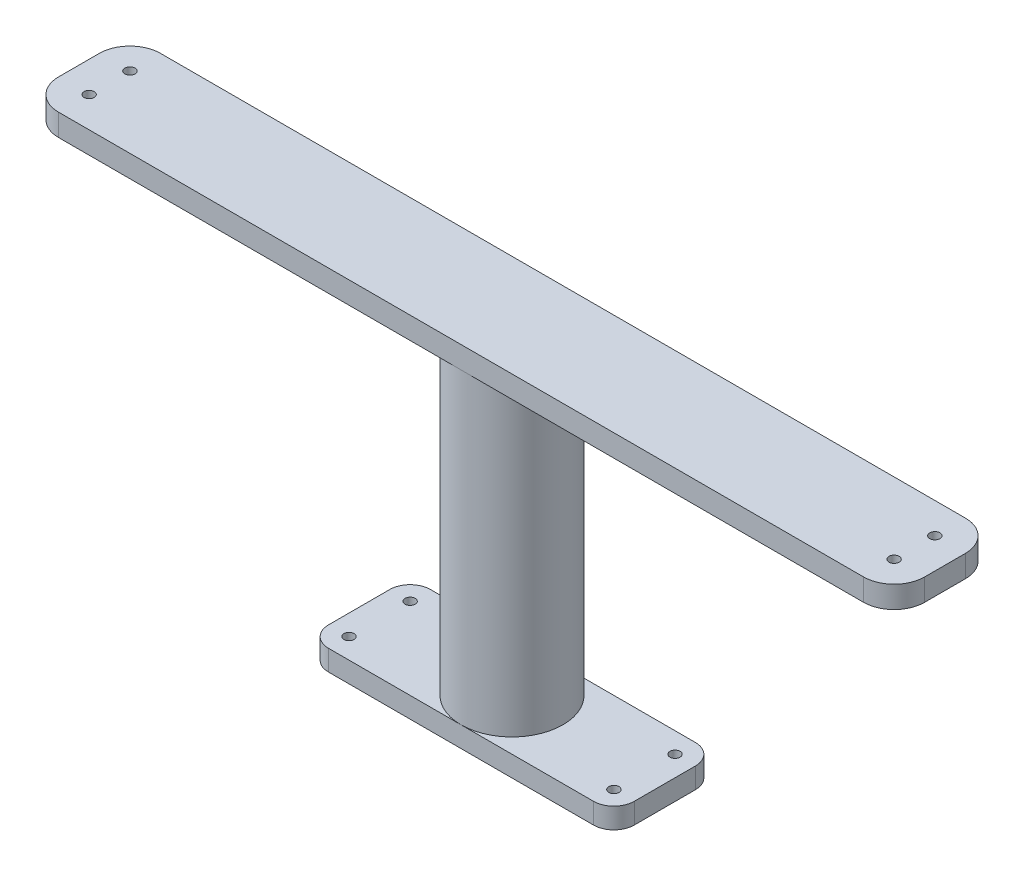
ISO-10303-21;
HEADER;
FILE_DESCRIPTION(('STEP AP214'),'2;1');
FILE_NAME('part.step','',(''),(''),'','','');
FILE_SCHEMA(('AUTOMOTIVE_DESIGN { 1 0 10303 214 1 1 1 1 }'));
ENDSEC;
DATA;
#1=APPLICATION_CONTEXT('core data for automotive mechanical design processes');
#2=APPLICATION_PROTOCOL_DEFINITION('international standard','automotive_design',2000,#1);
#3=PRODUCT_CONTEXT('',#1,'mechanical');
#4=PRODUCT('Part','Part','',(#3));
#5=PRODUCT_RELATED_PRODUCT_CATEGORY('part','',(#4));
#6=PRODUCT_DEFINITION_FORMATION('','',#4);
#7=PRODUCT_DEFINITION_CONTEXT('part definition',#1,'design');
#8=PRODUCT_DEFINITION('design','',#6,#7);
#9=PRODUCT_DEFINITION_SHAPE('','',#8);
#10=(LENGTH_UNIT() NAMED_UNIT(*) SI_UNIT(.MILLI.,.METRE.));
#11=(NAMED_UNIT(*) PLANE_ANGLE_UNIT() SI_UNIT($,.RADIAN.));
#12=(NAMED_UNIT(*) SI_UNIT($,.STERADIAN.) SOLID_ANGLE_UNIT());
#13=UNCERTAINTY_MEASURE_WITH_UNIT(LENGTH_MEASURE(1.E-05),#10,'distance_accuracy_value','');
#14=(GEOMETRIC_REPRESENTATION_CONTEXT(3) GLOBAL_UNCERTAINTY_ASSIGNED_CONTEXT((#13)) GLOBAL_UNIT_ASSIGNED_CONTEXT((#10,
#11,#12)) REPRESENTATION_CONTEXT('',''));
#15=CARTESIAN_POINT('',(0.,0.,0.));
#16=DIRECTION('',(0.,0.,1.));
#17=DIRECTION('',(1.,0.,0.));
#18=AXIS2_PLACEMENT_3D('',#15,#16,#17);
#19=CARTESIAN_POINT('',(0.,-341.625,0.));
#20=DIRECTION('',(0.,1.,0.));
#21=DIRECTION('',(0.,0.,1.));
#22=AXIS2_PLACEMENT_3D('',#19,#20,#21);
#23=CYLINDRICAL_SURFACE('',#22,50.);
#24=CARTESIAN_POINT('',(0.,-20.,0.));
#25=DIRECTION('',(0.,-1.,0.));
#26=DIRECTION('',(0.,0.,-1.));
#27=AXIS2_PLACEMENT_3D('',#24,#25,#26);
#28=CIRCLE('',#27,50.);
#29=CARTESIAN_POINT('',(0.,-20.,-50.));
#30=VERTEX_POINT('',#29);
#31=CARTESIAN_POINT('',(0.,-20.,50.));
#32=VERTEX_POINT('',#31);
#33=EDGE_CURVE('E327',#30,#32,#28,.F.);
#34=ORIENTED_EDGE('',*,*,#33,.F.);
#35=CARTESIAN_POINT('',(0.,-20.,0.));
#36=DIRECTION('',(0.,-1.,0.));
#37=DIRECTION('',(0.,0.,-1.));
#38=AXIS2_PLACEMENT_3D('',#35,#36,#37);
#39=CIRCLE('',#38,50.);
#40=EDGE_CURVE('E295',#30,#32,#39,.T.);
#41=ORIENTED_EDGE('',*,*,#40,.T.);
#42=EDGE_LOOP('',(#34,#41));
#43=FACE_BOUND('',#42,.T.);
#44=CARTESIAN_POINT('',(0.,-321.625,0.));
#45=DIRECTION('',(0.,1.,0.));
#46=DIRECTION('',(0.,0.,1.));
#47=AXIS2_PLACEMENT_3D('',#44,#45,#46);
#48=CIRCLE('',#47,50.);
#49=CARTESIAN_POINT('',(0.,-321.625,50.));
#50=VERTEX_POINT('',#49);
#51=CARTESIAN_POINT('',(0.,-321.625,-50.));
#52=VERTEX_POINT('',#51);
#53=EDGE_CURVE('E280',#50,#52,#48,.F.);
#54=ORIENTED_EDGE('',*,*,#53,.F.);
#55=CARTESIAN_POINT('',(0.,-321.625,0.));
#56=DIRECTION('',(0.,1.,0.));
#57=DIRECTION('',(0.,0.,1.));
#58=AXIS2_PLACEMENT_3D('',#55,#56,#57);
#59=CIRCLE('',#58,50.);
#60=EDGE_CURVE('E270',#50,#52,#59,.T.);
#61=ORIENTED_EDGE('',*,*,#60,.T.);
#62=EDGE_LOOP('',(#54,#61));
#63=FACE_BOUND('',#62,.T.);
#64=ADVANCED_FACE('F108',(#43,#63),#23,.T.);
#65=CARTESIAN_POINT('',(-395.,1.5875,-20.));
#66=DIRECTION('',(0.,1.,0.));
#67=DIRECTION('',(0.,0.,1.));
#68=AXIS2_PLACEMENT_3D('',#65,#66,#67);
#69=PLANE('',#68);
#70=CARTESIAN_POINT('',(395.,1.5875,-20.));
#71=DIRECTION('',(0.,1.,0.));
#72=DIRECTION('',(0.,0.,1.));
#73=AXIS2_PLACEMENT_3D('',#70,#71,#72);
#74=CIRCLE('',#73,4.99999999999999);
#75=CARTESIAN_POINT('',(395.,1.5875,-15.));
#76=VERTEX_POINT('',#75);
#77=EDGE_CURVE('E391',#76,#76,#74,.T.);
#78=ORIENTED_EDGE('',*,*,#77,.F.);
#79=EDGE_LOOP('',(#78));
#80=FACE_BOUND('',#79,.T.);
#81=CARTESIAN_POINT('',(-395.,1.5875,20.));
#82=DIRECTION('',(0.,1.,0.));
#83=DIRECTION('',(0.,0.,1.));
#84=AXIS2_PLACEMENT_3D('',#81,#82,#83);
#85=CIRCLE('',#84,4.99999999999999);
#86=CARTESIAN_POINT('',(-395.,1.5875,25.));
#87=VERTEX_POINT('',#86);
#88=EDGE_CURVE('E397',#87,#87,#85,.T.);
#89=ORIENTED_EDGE('',*,*,#88,.F.);
#90=EDGE_LOOP('',(#89));
#91=FACE_BOUND('',#90,.T.);
#92=CARTESIAN_POINT('',(-395.,1.5875,-20.));
#93=DIRECTION('',(0.,1.,0.));
#94=DIRECTION('',(0.,0.,1.));
#95=AXIS2_PLACEMENT_3D('',#92,#93,#94);
#96=CIRCLE('',#95,30.);
#97=CARTESIAN_POINT('',(-395.,1.5875,-50.));
#98=VERTEX_POINT('',#97);
#99=CARTESIAN_POINT('',(-425.,1.5875,-19.9999999999998));
#100=VERTEX_POINT('',#99);
#101=EDGE_CURVE('E400',#98,#100,#96,.T.);
#102=ORIENTED_EDGE('',*,*,#101,.T.);
#103=DIRECTION('',(0.,0.,1.));
#104=VECTOR('',#103,1.);
#105=CARTESIAN_POINT('',(-425.,1.5875,-19.9999999999998));
#106=LINE('',#105,#104);
#107=CARTESIAN_POINT('',(-425.,1.5875,19.9999999999998));
#108=VERTEX_POINT('',#107);
#109=EDGE_CURVE('E402',#100,#108,#106,.T.);
#110=ORIENTED_EDGE('',*,*,#109,.T.);
#111=CARTESIAN_POINT('',(-395.,1.5875,20.));
#112=DIRECTION('',(0.,1.,0.));
#113=DIRECTION('',(0.,0.,1.));
#114=AXIS2_PLACEMENT_3D('',#111,#112,#113);
#115=CIRCLE('',#114,30.);
#116=CARTESIAN_POINT('',(-395.,1.5875,50.));
#117=VERTEX_POINT('',#116);
#118=EDGE_CURVE('E404',#108,#117,#115,.T.);
#119=ORIENTED_EDGE('',*,*,#118,.T.);
#120=DIRECTION('',(1.,0.,0.));
#121=VECTOR('',#120,1.);
#122=CARTESIAN_POINT('',(-395.,1.5875,50.));
#123=LINE('',#122,#121);
#124=CARTESIAN_POINT('',(395.,1.5875,50.));
#125=VERTEX_POINT('',#124);
#126=EDGE_CURVE('E406',#117,#125,#123,.T.);
#127=ORIENTED_EDGE('',*,*,#126,.T.);
#128=CARTESIAN_POINT('',(395.,1.5875,20.));
#129=DIRECTION('',(0.,1.,0.));
#130=DIRECTION('',(0.,0.,1.));
#131=AXIS2_PLACEMENT_3D('',#128,#129,#130);
#132=CIRCLE('',#131,30.);
#133=CARTESIAN_POINT('',(425.,1.5875,19.9999999999998));
#134=VERTEX_POINT('',#133);
#135=EDGE_CURVE('E408',#125,#134,#132,.T.);
#136=ORIENTED_EDGE('',*,*,#135,.T.);
#137=DIRECTION('',(0.,0.,-1.));
#138=VECTOR('',#137,1.);
#139=CARTESIAN_POINT('',(425.,1.5875,-19.9999999999998));
#140=LINE('',#139,#138);
#141=CARTESIAN_POINT('',(425.,1.5875,-19.9999999999998));
#142=VERTEX_POINT('',#141);
#143=EDGE_CURVE('E410',#134,#142,#140,.T.);
#144=ORIENTED_EDGE('',*,*,#143,.T.);
#145=CARTESIAN_POINT('',(395.,1.5875,-20.));
#146=DIRECTION('',(0.,1.,0.));
#147=DIRECTION('',(0.,0.,-1.));
#148=AXIS2_PLACEMENT_3D('',#145,#146,#147);
#149=CIRCLE('',#148,30.);
#150=CARTESIAN_POINT('',(395.,1.5875,-50.));
#151=VERTEX_POINT('',#150);
#152=EDGE_CURVE('E129',#142,#151,#149,.T.);
#153=ORIENTED_EDGE('',*,*,#152,.T.);
#154=DIRECTION('',(-1.,0.,0.));
#155=VECTOR('',#154,1.);
#156=CARTESIAN_POINT('',(-395.,1.5875,-50.));
#157=LINE('',#156,#155);
#158=EDGE_CURVE('E124',#151,#98,#157,.T.);
#159=ORIENTED_EDGE('',*,*,#158,.T.);
#160=EDGE_LOOP('',(#102,#110,#119,#127,#136,#144,#153,#159));
#161=FACE_BOUND('',#160,.T.);
#162=CARTESIAN_POINT('',(-395.,1.5875,-20.));
#163=DIRECTION('',(0.,1.,0.));
#164=DIRECTION('',(0.,0.,1.));
#165=AXIS2_PLACEMENT_3D('',#162,#163,#164);
#166=CIRCLE('',#165,4.99999999999999);
#167=CARTESIAN_POINT('',(-395.,1.5875,-15.));
#168=VERTEX_POINT('',#167);
#169=EDGE_CURVE('E394',#168,#168,#166,.T.);
#170=ORIENTED_EDGE('',*,*,#169,.F.);
#171=EDGE_LOOP('',(#170));
#172=FACE_BOUND('',#171,.T.);
#173=CARTESIAN_POINT('',(395.,1.5875,20.));
#174=DIRECTION('',(0.,1.,0.));
#175=DIRECTION('',(0.,0.,1.));
#176=AXIS2_PLACEMENT_3D('',#173,#174,#175);
#177=CIRCLE('',#176,4.99999999999999);
#178=CARTESIAN_POINT('',(395.,1.5875,25.));
#179=VERTEX_POINT('',#178);
#180=EDGE_CURVE('E388',#179,#179,#177,.T.);
#181=ORIENTED_EDGE('',*,*,#180,.F.);
#182=EDGE_LOOP('',(#181));
#183=FACE_BOUND('',#182,.T.);
#184=ADVANCED_FACE('F457',(#80,#91,#161,#172,#183),#69,.T.);
#185=CARTESIAN_POINT('',(-395.,1.5875,-20.));
#186=DIRECTION('',(0.,-1.,0.));
#187=DIRECTION('',(0.,0.,-1.));
#188=AXIS2_PLACEMENT_3D('',#185,#186,#187);
#189=CYLINDRICAL_SURFACE('',#188,30.);
#190=DIRECTION('',(0.,-1.,0.));
#191=VECTOR('',#190,1.);
#192=CARTESIAN_POINT('',(-395.,1.5875,-50.));
#193=LINE('',#192,#191);
#194=CARTESIAN_POINT('',(-395.,-20.,-50.));
#195=VERTEX_POINT('',#194);
#196=EDGE_CURVE('E414',#98,#195,#193,.T.);
#197=ORIENTED_EDGE('',*,*,#196,.T.);
#198=CARTESIAN_POINT('',(-395.,-20.,-20.));
#199=DIRECTION('',(0.,-1.,0.));
#200=DIRECTION('',(0.,0.,-1.));
#201=AXIS2_PLACEMENT_3D('',#198,#199,#200);
#202=CIRCLE('',#201,30.);
#203=CARTESIAN_POINT('',(-425.,-20.,-19.9999999999998));
#204=VERTEX_POINT('',#203);
#205=EDGE_CURVE('E339',#204,#195,#202,.T.);
#206=ORIENTED_EDGE('',*,*,#205,.F.);
#207=DIRECTION('',(0.,-1.,0.));
#208=VECTOR('',#207,1.);
#209=CARTESIAN_POINT('',(-425.,1.5875,-19.9999999999998));
#210=LINE('',#209,#208);
#211=EDGE_CURVE('E12',#100,#204,#210,.T.);
#212=ORIENTED_EDGE('',*,*,#211,.F.);
#213=ORIENTED_EDGE('',*,*,#101,.F.);
#214=EDGE_LOOP('',(#197,#206,#212,#213));
#215=FACE_BOUND('',#214,.T.);
#216=ADVANCED_FACE('F110',(#215),#189,.T.);
#217=CARTESIAN_POINT('',(-425.,1.5875,-19.9999999999998));
#218=DIRECTION('',(1.,0.,0.));
#219=DIRECTION('',(0.,0.,-1.));
#220=AXIS2_PLACEMENT_3D('',#217,#218,#219);
#221=PLANE('',#220);
#222=ORIENTED_EDGE('',*,*,#211,.T.);
#223=DIRECTION('',(0.,0.,-1.));
#224=VECTOR('',#223,1.);
#225=CARTESIAN_POINT('',(-425.,-20.,0.));
#226=LINE('',#225,#224);
#227=CARTESIAN_POINT('',(-425.,-20.,19.9999999999998));
#228=VERTEX_POINT('',#227);
#229=EDGE_CURVE('E336',#228,#204,#226,.T.);
#230=ORIENTED_EDGE('',*,*,#229,.F.);
#231=DIRECTION('',(0.,-1.,0.));
#232=VECTOR('',#231,1.);
#233=CARTESIAN_POINT('',(-425.,1.5875,19.9999999999998));
#234=LINE('',#233,#232);
#235=EDGE_CURVE('E117',#108,#228,#234,.T.);
#236=ORIENTED_EDGE('',*,*,#235,.F.);
#237=ORIENTED_EDGE('',*,*,#109,.F.);
#238=EDGE_LOOP('',(#222,#230,#236,#237));
#239=FACE_BOUND('',#238,.T.);
#240=ADVANCED_FACE('F437',(#239),#221,.F.);
#241=CARTESIAN_POINT('',(-395.,1.5875,20.));
#242=DIRECTION('',(0.,-1.,0.));
#243=DIRECTION('',(0.,0.,-1.));
#244=AXIS2_PLACEMENT_3D('',#241,#242,#243);
#245=CYLINDRICAL_SURFACE('',#244,30.);
#246=ORIENTED_EDGE('',*,*,#235,.T.);
#247=CARTESIAN_POINT('',(-395.,-20.,20.));
#248=DIRECTION('',(0.,-1.,0.));
#249=DIRECTION('',(0.,0.,-1.));
#250=AXIS2_PLACEMENT_3D('',#247,#248,#249);
#251=CIRCLE('',#250,30.);
#252=CARTESIAN_POINT('',(-395.,-20.,50.));
#253=VERTEX_POINT('',#252);
#254=EDGE_CURVE('E333',#253,#228,#251,.T.);
#255=ORIENTED_EDGE('',*,*,#254,.F.);
#256=DIRECTION('',(0.,-1.,0.));
#257=VECTOR('',#256,1.);
#258=CARTESIAN_POINT('',(-395.,1.5875,50.));
#259=LINE('',#258,#257);
#260=EDGE_CURVE('E424',#117,#253,#259,.T.);
#261=ORIENTED_EDGE('',*,*,#260,.F.);
#262=ORIENTED_EDGE('',*,*,#118,.F.);
#263=EDGE_LOOP('',(#246,#255,#261,#262));
#264=FACE_BOUND('',#263,.T.);
#265=ADVANCED_FACE('F429',(#264),#245,.T.);
#266=CARTESIAN_POINT('',(-395.,1.5875,50.));
#267=DIRECTION('',(0.,0.,-1.));
#268=DIRECTION('',(-1.,0.,0.));
#269=AXIS2_PLACEMENT_3D('',#266,#267,#268);
#270=PLANE('',#269);
#271=DIRECTION('',(-1.,0.,0.));
#272=VECTOR('',#271,1.);
#273=CARTESIAN_POINT('',(0.,-20.,50.));
#274=LINE('',#273,#272);
#275=CARTESIAN_POINT('',(395.,-20.,50.));
#276=VERTEX_POINT('',#275);
#277=EDGE_CURVE('E303',#276,#32,#274,.T.);
#278=ORIENTED_EDGE('',*,*,#277,.F.);
#279=DIRECTION('',(0.,-1.,0.));
#280=VECTOR('',#279,1.);
#281=CARTESIAN_POINT('',(395.,1.5875,50.));
#282=LINE('',#281,#280);
#283=EDGE_CURVE('E422',#125,#276,#282,.T.);
#284=ORIENTED_EDGE('',*,*,#283,.F.);
#285=ORIENTED_EDGE('',*,*,#126,.F.);
#286=ORIENTED_EDGE('',*,*,#260,.T.);
#287=DIRECTION('',(-1.,0.,0.));
#288=VECTOR('',#287,1.);
#289=CARTESIAN_POINT('',(0.,-20.,50.));
#290=LINE('',#289,#288);
#291=EDGE_CURVE('E330',#32,#253,#290,.T.);
#292=ORIENTED_EDGE('',*,*,#291,.F.);
#293=EDGE_LOOP('',(#278,#284,#285,#286,#292));
#294=FACE_BOUND('',#293,.T.);
#295=ADVANCED_FACE('F453',(#294),#270,.F.);
#296=CARTESIAN_POINT('',(395.,1.5875,20.));
#297=DIRECTION('',(0.,-1.,0.));
#298=DIRECTION('',(0.,0.,-1.));
#299=AXIS2_PLACEMENT_3D('',#296,#297,#298);
#300=CYLINDRICAL_SURFACE('',#299,30.);
#301=ORIENTED_EDGE('',*,*,#283,.T.);
#302=CARTESIAN_POINT('',(395.,-20.,20.));
#303=DIRECTION('',(0.,-1.,0.));
#304=DIRECTION('',(0.,0.,-1.));
#305=AXIS2_PLACEMENT_3D('',#302,#303,#304);
#306=CIRCLE('',#305,30.);
#307=CARTESIAN_POINT('',(425.,-20.,19.9999999999998));
#308=VERTEX_POINT('',#307);
#309=EDGE_CURVE('E308',#308,#276,#306,.T.);
#310=ORIENTED_EDGE('',*,*,#309,.F.);
#311=DIRECTION('',(0.,-1.,0.));
#312=VECTOR('',#311,1.);
#313=CARTESIAN_POINT('',(425.,1.5875,19.9999999999998));
#314=LINE('',#313,#312);
#315=EDGE_CURVE('E420',#134,#308,#314,.T.);
#316=ORIENTED_EDGE('',*,*,#315,.F.);
#317=ORIENTED_EDGE('',*,*,#135,.F.);
#318=EDGE_LOOP('',(#301,#310,#316,#317));
#319=FACE_BOUND('',#318,.T.);
#320=ADVANCED_FACE('F464',(#319),#300,.T.);
#321=CARTESIAN_POINT('',(425.,1.5875,-19.9999999999998));
#322=DIRECTION('',(-1.,0.,0.));
#323=DIRECTION('',(0.,0.,1.));
#324=AXIS2_PLACEMENT_3D('',#321,#322,#323);
#325=PLANE('',#324);
#326=ORIENTED_EDGE('',*,*,#315,.T.);
#327=DIRECTION('',(0.,0.,1.));
#328=VECTOR('',#327,1.);
#329=CARTESIAN_POINT('',(425.,-20.,0.));
#330=LINE('',#329,#328);
#331=CARTESIAN_POINT('',(425.,-20.,-19.9999999999998));
#332=VERTEX_POINT('',#331);
#333=EDGE_CURVE('E311',#332,#308,#330,.T.);
#334=ORIENTED_EDGE('',*,*,#333,.F.);
#335=DIRECTION('',(0.,-1.,0.));
#336=VECTOR('',#335,1.);
#337=CARTESIAN_POINT('',(425.,1.5875,-19.9999999999998));
#338=LINE('',#337,#336);
#339=EDGE_CURVE('E418',#142,#332,#338,.T.);
#340=ORIENTED_EDGE('',*,*,#339,.F.);
#341=ORIENTED_EDGE('',*,*,#143,.F.);
#342=EDGE_LOOP('',(#326,#334,#340,#341));
#343=FACE_BOUND('',#342,.T.);
#344=ADVANCED_FACE('F467',(#343),#325,.F.);
#345=CARTESIAN_POINT('',(395.,1.5875,-20.));
#346=DIRECTION('',(0.,-1.,0.));
#347=DIRECTION('',(0.,0.,-1.));
#348=AXIS2_PLACEMENT_3D('',#345,#346,#347);
#349=CYLINDRICAL_SURFACE('',#348,30.);
#350=ORIENTED_EDGE('',*,*,#339,.T.);
#351=CARTESIAN_POINT('',(395.,-20.,-20.));
#352=DIRECTION('',(0.,-1.,0.));
#353=DIRECTION('',(0.,0.,-1.));
#354=AXIS2_PLACEMENT_3D('',#351,#352,#353);
#355=CIRCLE('',#354,30.);
#356=CARTESIAN_POINT('',(395.,-20.,-50.));
#357=VERTEX_POINT('',#356);
#358=EDGE_CURVE('E296',#357,#332,#355,.T.);
#359=ORIENTED_EDGE('',*,*,#358,.F.);
#360=DIRECTION('',(0.,-1.,0.));
#361=VECTOR('',#360,1.);
#362=CARTESIAN_POINT('',(395.,1.5875,-50.));
#363=LINE('',#362,#361);
#364=EDGE_CURVE('E416',#151,#357,#363,.T.);
#365=ORIENTED_EDGE('',*,*,#364,.F.);
#366=ORIENTED_EDGE('',*,*,#152,.F.);
#367=EDGE_LOOP('',(#350,#359,#365,#366));
#368=FACE_BOUND('',#367,.T.);
#369=ADVANCED_FACE('F469',(#368),#349,.T.);
#370=CARTESIAN_POINT('',(-395.,1.5875,-50.));
#371=DIRECTION('',(0.,0.,1.));
#372=DIRECTION('',(1.,0.,0.));
#373=AXIS2_PLACEMENT_3D('',#370,#371,#372);
#374=PLANE('',#373);
#375=ORIENTED_EDGE('',*,*,#364,.T.);
#376=DIRECTION('',(1.,0.,0.));
#377=VECTOR('',#376,1.);
#378=CARTESIAN_POINT('',(0.,-20.,-50.));
#379=LINE('',#378,#377);
#380=EDGE_CURVE('E300',#30,#357,#379,.T.);
#381=ORIENTED_EDGE('',*,*,#380,.F.);
#382=DIRECTION('',(1.,0.,0.));
#383=VECTOR('',#382,1.);
#384=CARTESIAN_POINT('',(0.,-20.,-50.));
#385=LINE('',#384,#383);
#386=EDGE_CURVE('E324',#195,#30,#385,.T.);
#387=ORIENTED_EDGE('',*,*,#386,.F.);
#388=ORIENTED_EDGE('',*,*,#196,.F.);
#389=ORIENTED_EDGE('',*,*,#158,.F.);
#390=EDGE_LOOP('',(#375,#381,#387,#388,#389));
#391=FACE_BOUND('',#390,.T.);
#392=ADVANCED_FACE('F444',(#391),#374,.F.);
#393=CARTESIAN_POINT('',(-395.,1.5875,20.));
#394=DIRECTION('',(0.,-1.,0.));
#395=DIRECTION('',(0.,0.,-1.));
#396=AXIS2_PLACEMENT_3D('',#393,#394,#395);
#397=CYLINDRICAL_SURFACE('',#396,4.99999999999999);
#398=ORIENTED_EDGE('',*,*,#88,.T.);
#399=EDGE_LOOP('',(#398));
#400=FACE_BOUND('',#399,.T.);
#401=CARTESIAN_POINT('',(-395.,-20.,20.));
#402=DIRECTION('',(0.,-1.,0.));
#403=DIRECTION('',(0.,0.,-1.));
#404=AXIS2_PLACEMENT_3D('',#401,#402,#403);
#405=CIRCLE('',#404,4.99999999999999);
#406=CARTESIAN_POINT('',(-395.,-20.,15.));
#407=VERTEX_POINT('',#406);
#408=EDGE_CURVE('E299',#407,#407,#405,.F.);
#409=ORIENTED_EDGE('',*,*,#408,.F.);
#410=EDGE_LOOP('',(#409));
#411=FACE_BOUND('',#410,.T.);
#412=ADVANCED_FACE('F476',(#400,#411),#397,.F.);
#413=CARTESIAN_POINT('',(-395.,1.5875,-20.));
#414=DIRECTION('',(0.,-1.,0.));
#415=DIRECTION('',(0.,0.,-1.));
#416=AXIS2_PLACEMENT_3D('',#413,#414,#415);
#417=CYLINDRICAL_SURFACE('',#416,4.99999999999999);
#418=ORIENTED_EDGE('',*,*,#169,.T.);
#419=EDGE_LOOP('',(#418));
#420=FACE_BOUND('',#419,.T.);
#421=CARTESIAN_POINT('',(-395.,-20.,-20.));
#422=DIRECTION('',(0.,-1.,0.));
#423=DIRECTION('',(0.,0.,-1.));
#424=AXIS2_PLACEMENT_3D('',#421,#422,#423);
#425=CIRCLE('',#424,4.99999999999999);
#426=CARTESIAN_POINT('',(-395.,-20.,-25.));
#427=VERTEX_POINT('',#426);
#428=EDGE_CURVE('E321',#427,#427,#425,.F.);
#429=ORIENTED_EDGE('',*,*,#428,.F.);
#430=EDGE_LOOP('',(#429));
#431=FACE_BOUND('',#430,.T.);
#432=ADVANCED_FACE('F498',(#420,#431),#417,.F.);
#433=CARTESIAN_POINT('',(395.,1.5875,-20.));
#434=DIRECTION('',(0.,-1.,0.));
#435=DIRECTION('',(0.,0.,-1.));
#436=AXIS2_PLACEMENT_3D('',#433,#434,#435);
#437=CYLINDRICAL_SURFACE('',#436,4.99999999999999);
#438=ORIENTED_EDGE('',*,*,#77,.T.);
#439=EDGE_LOOP('',(#438));
#440=FACE_BOUND('',#439,.T.);
#441=CARTESIAN_POINT('',(395.,-20.,-20.));
#442=DIRECTION('',(0.,-1.,0.));
#443=DIRECTION('',(0.,0.,-1.));
#444=AXIS2_PLACEMENT_3D('',#441,#442,#443);
#445=CIRCLE('',#444,4.99999999999999);
#446=CARTESIAN_POINT('',(395.,-20.,-25.));
#447=VERTEX_POINT('',#446);
#448=EDGE_CURVE('E314',#447,#447,#445,.T.);
#449=ORIENTED_EDGE('',*,*,#448,.T.);
#450=EDGE_LOOP('',(#449));
#451=FACE_BOUND('',#450,.T.);
#452=ADVANCED_FACE('F494',(#440,#451),#437,.F.);
#453=CARTESIAN_POINT('',(395.,1.5875,20.));
#454=DIRECTION('',(0.,-1.,0.));
#455=DIRECTION('',(0.,0.,-1.));
#456=AXIS2_PLACEMENT_3D('',#453,#454,#455);
#457=CYLINDRICAL_SURFACE('',#456,4.99999999999999);
#458=ORIENTED_EDGE('',*,*,#180,.T.);
#459=EDGE_LOOP('',(#458));
#460=FACE_BOUND('',#459,.T.);
#461=CARTESIAN_POINT('',(395.,-20.,20.));
#462=DIRECTION('',(0.,-1.,0.));
#463=DIRECTION('',(0.,0.,-1.));
#464=AXIS2_PLACEMENT_3D('',#461,#462,#463);
#465=CIRCLE('',#464,4.99999999999999);
#466=CARTESIAN_POINT('',(395.,-20.,15.));
#467=VERTEX_POINT('',#466);
#468=EDGE_CURVE('E306',#467,#467,#465,.T.);
#469=ORIENTED_EDGE('',*,*,#468,.T.);
#470=EDGE_LOOP('',(#469));
#471=FACE_BOUND('',#470,.T.);
#472=ADVANCED_FACE('F490',(#460,#471),#457,.F.);
#473=CARTESIAN_POINT('',(-130.,-341.843965517241,30.));
#474=DIRECTION('',(0.,-1.,0.));
#475=DIRECTION('',(0.,0.,-1.));
#476=AXIS2_PLACEMENT_3D('',#473,#474,#475);
#477=PLANE('',#476);
#478=CARTESIAN_POINT('',(130.,-341.843965517241,30.));
#479=DIRECTION('',(0.,-1.,0.));
#480=DIRECTION('',(0.,0.,-1.));
#481=AXIS2_PLACEMENT_3D('',#478,#479,#480);
#482=CIRCLE('',#481,5.00000000000002);
#483=CARTESIAN_POINT('',(130.,-341.843965517241,25.));
#484=VERTEX_POINT('',#483);
#485=EDGE_CURVE('E345',#484,#484,#482,.T.);
#486=ORIENTED_EDGE('',*,*,#485,.F.);
#487=EDGE_LOOP('',(#486));
#488=FACE_BOUND('',#487,.T.);
#489=CARTESIAN_POINT('',(-130.,-341.843965517241,-30.));
#490=DIRECTION('',(0.,-1.,0.));
#491=DIRECTION('',(0.,0.,-1.));
#492=AXIS2_PLACEMENT_3D('',#489,#490,#491);
#493=CIRCLE('',#492,5.00000000000002);
#494=CARTESIAN_POINT('',(-130.,-341.843965517241,-35.));
#495=VERTEX_POINT('',#494);
#496=EDGE_CURVE('E351',#495,#495,#493,.T.);
#497=ORIENTED_EDGE('',*,*,#496,.F.);
#498=EDGE_LOOP('',(#497));
#499=FACE_BOUND('',#498,.T.);
#500=CARTESIAN_POINT('',(-130.,-341.843965517241,30.));
#501=DIRECTION('',(0.,-1.,0.));
#502=DIRECTION('',(0.,0.,-1.));
#503=AXIS2_PLACEMENT_3D('',#500,#501,#502);
#504=CIRCLE('',#503,20.);
#505=CARTESIAN_POINT('',(-130.,-341.843965517241,50.));
#506=VERTEX_POINT('',#505);
#507=CARTESIAN_POINT('',(-150.,-341.843965517241,29.9999999999999));
#508=VERTEX_POINT('',#507);
#509=EDGE_CURVE('E354',#506,#508,#504,.T.);
#510=ORIENTED_EDGE('',*,*,#509,.T.);
#511=DIRECTION('',(0.,0.,-1.));
#512=VECTOR('',#511,1.);
#513=CARTESIAN_POINT('',(-150.,-341.843965517241,29.9999999999999));
#514=LINE('',#513,#512);
#515=CARTESIAN_POINT('',(-150.,-341.843965517241,-29.9999999999999));
#516=VERTEX_POINT('',#515);
#517=EDGE_CURVE('E357',#508,#516,#514,.T.);
#518=ORIENTED_EDGE('',*,*,#517,.T.);
#519=CARTESIAN_POINT('',(-130.,-341.843965517241,-30.));
#520=DIRECTION('',(0.,-1.,0.));
#521=DIRECTION('',(0.,0.,-1.));
#522=AXIS2_PLACEMENT_3D('',#519,#520,#521);
#523=CIRCLE('',#522,20.);
#524=CARTESIAN_POINT('',(-130.,-341.843965517241,-50.));
#525=VERTEX_POINT('',#524);
#526=EDGE_CURVE('E359',#516,#525,#523,.T.);
#527=ORIENTED_EDGE('',*,*,#526,.T.);
#528=DIRECTION('',(1.,0.,0.));
#529=VECTOR('',#528,1.);
#530=CARTESIAN_POINT('',(-130.,-341.843965517241,-50.));
#531=LINE('',#530,#529);
#532=CARTESIAN_POINT('',(130.,-341.843965517241,-50.));
#533=VERTEX_POINT('',#532);
#534=EDGE_CURVE('E361',#525,#533,#531,.T.);
#535=ORIENTED_EDGE('',*,*,#534,.T.);
#536=CARTESIAN_POINT('',(130.,-341.843965517241,-30.));
#537=DIRECTION('',(0.,-1.,0.));
#538=DIRECTION('',(0.,0.,-1.));
#539=AXIS2_PLACEMENT_3D('',#536,#537,#538);
#540=CIRCLE('',#539,20.);
#541=CARTESIAN_POINT('',(150.,-341.843965517241,-29.9999999999999));
#542=VERTEX_POINT('',#541);
#543=EDGE_CURVE('E363',#533,#542,#540,.T.);
#544=ORIENTED_EDGE('',*,*,#543,.T.);
#545=DIRECTION('',(0.,0.,1.));
#546=VECTOR('',#545,1.);
#547=CARTESIAN_POINT('',(150.,-341.843965517241,29.9999999999999));
#548=LINE('',#547,#546);
#549=CARTESIAN_POINT('',(150.,-341.843965517241,29.9999999999999));
#550=VERTEX_POINT('',#549);
#551=EDGE_CURVE('E365',#542,#550,#548,.T.);
#552=ORIENTED_EDGE('',*,*,#551,.T.);
#553=CARTESIAN_POINT('',(130.,-341.843965517241,30.));
#554=DIRECTION('',(0.,-1.,0.));
#555=DIRECTION('',(0.,0.,1.));
#556=AXIS2_PLACEMENT_3D('',#553,#554,#555);
#557=CIRCLE('',#556,20.);
#558=CARTESIAN_POINT('',(130.,-341.843965517241,50.));
#559=VERTEX_POINT('',#558);
#560=EDGE_CURVE('E239',#550,#559,#557,.T.);
#561=ORIENTED_EDGE('',*,*,#560,.T.);
#562=DIRECTION('',(-1.,0.,0.));
#563=VECTOR('',#562,1.);
#564=CARTESIAN_POINT('',(-130.,-341.843965517241,50.));
#565=LINE('',#564,#563);
#566=EDGE_CURVE('E368',#559,#506,#565,.T.);
#567=ORIENTED_EDGE('',*,*,#566,.T.);
#568=EDGE_LOOP('',(#510,#518,#527,#535,#544,#552,#561,#567));
#569=FACE_BOUND('',#568,.T.);
#570=CARTESIAN_POINT('',(-130.,-341.843965517241,30.));
#571=DIRECTION('',(0.,-1.,0.));
#572=DIRECTION('',(0.,0.,-1.));
#573=AXIS2_PLACEMENT_3D('',#570,#571,#572);
#574=CIRCLE('',#573,5.00000000000002);
#575=CARTESIAN_POINT('',(-130.,-341.843965517241,25.));
#576=VERTEX_POINT('',#575);
#577=EDGE_CURVE('E348',#576,#576,#574,.T.);
#578=ORIENTED_EDGE('',*,*,#577,.F.);
#579=EDGE_LOOP('',(#578));
#580=FACE_BOUND('',#579,.T.);
#581=CARTESIAN_POINT('',(130.,-341.843965517241,-30.));
#582=DIRECTION('',(0.,-1.,0.));
#583=DIRECTION('',(0.,0.,-1.));
#584=AXIS2_PLACEMENT_3D('',#581,#582,#583);
#585=CIRCLE('',#584,5.00000000000002);
#586=CARTESIAN_POINT('',(130.,-341.843965517241,-35.));
#587=VERTEX_POINT('',#586);
#588=EDGE_CURVE('E342',#587,#587,#585,.T.);
#589=ORIENTED_EDGE('',*,*,#588,.F.);
#590=EDGE_LOOP('',(#589));
#591=FACE_BOUND('',#590,.T.);
#592=ADVANCED_FACE('F493',(#488,#499,#569,#580,#591),#477,.T.);
#593=CARTESIAN_POINT('',(-130.,-341.843965517241,30.));
#594=DIRECTION('',(0.,1.,0.));
#595=DIRECTION('',(0.,0.,1.));
#596=AXIS2_PLACEMENT_3D('',#593,#594,#595);
#597=CYLINDRICAL_SURFACE('',#596,20.);
#598=DIRECTION('',(0.,1.,0.));
#599=VECTOR('',#598,1.);
#600=CARTESIAN_POINT('',(-130.,-341.843965517241,50.));
#601=LINE('',#600,#599);
#602=CARTESIAN_POINT('',(-130.,-321.625,50.));
#603=VERTEX_POINT('',#602);
#604=EDGE_CURVE('E370',#506,#603,#601,.T.);
#605=ORIENTED_EDGE('',*,*,#604,.T.);
#606=CARTESIAN_POINT('',(-130.,-321.625,30.));
#607=DIRECTION('',(0.,1.,0.));
#608=DIRECTION('',(0.,0.,1.));
#609=AXIS2_PLACEMENT_3D('',#606,#607,#608);
#610=CIRCLE('',#609,20.);
#611=CARTESIAN_POINT('',(-150.,-321.625,29.9999999999999));
#612=VERTEX_POINT('',#611);
#613=EDGE_CURVE('E274',#612,#603,#610,.T.);
#614=ORIENTED_EDGE('',*,*,#613,.F.);
#615=DIRECTION('',(0.,1.,0.));
#616=VECTOR('',#615,1.);
#617=CARTESIAN_POINT('',(-150.,-341.843965517241,29.9999999999999));
#618=LINE('',#617,#616);
#619=EDGE_CURVE('E380',#508,#612,#618,.T.);
#620=ORIENTED_EDGE('',*,*,#619,.F.);
#621=ORIENTED_EDGE('',*,*,#509,.F.);
#622=EDGE_LOOP('',(#605,#614,#620,#621));
#623=FACE_BOUND('',#622,.T.);
#624=ADVANCED_FACE('F552',(#623),#597,.T.);
#625=CARTESIAN_POINT('',(-150.,-341.843965517241,29.9999999999999));
#626=DIRECTION('',(1.,0.,0.));
#627=DIRECTION('',(0.,0.,-1.));
#628=AXIS2_PLACEMENT_3D('',#625,#626,#627);
#629=PLANE('',#628);
#630=ORIENTED_EDGE('',*,*,#619,.T.);
#631=DIRECTION('',(0.,0.,1.));
#632=VECTOR('',#631,1.);
#633=CARTESIAN_POINT('',(-150.,-321.625,0.));
#634=LINE('',#633,#632);
#635=CARTESIAN_POINT('',(-150.,-321.625,-29.9999999999999));
#636=VERTEX_POINT('',#635);
#637=EDGE_CURVE('E289',#636,#612,#634,.T.);
#638=ORIENTED_EDGE('',*,*,#637,.F.);
#639=DIRECTION('',(0.,1.,0.));
#640=VECTOR('',#639,1.);
#641=CARTESIAN_POINT('',(-150.,-341.843965517241,-29.9999999999999));
#642=LINE('',#641,#640);
#643=EDGE_CURVE('E378',#516,#636,#642,.T.);
#644=ORIENTED_EDGE('',*,*,#643,.F.);
#645=ORIENTED_EDGE('',*,*,#517,.F.);
#646=EDGE_LOOP('',(#630,#638,#644,#645));
#647=FACE_BOUND('',#646,.T.);
#648=ADVANCED_FACE('F549',(#647),#629,.F.);
#649=CARTESIAN_POINT('',(-130.,-341.843965517241,-30.));
#650=DIRECTION('',(0.,1.,0.));
#651=DIRECTION('',(0.,0.,1.));
#652=AXIS2_PLACEMENT_3D('',#649,#650,#651);
#653=CYLINDRICAL_SURFACE('',#652,20.);
#654=ORIENTED_EDGE('',*,*,#643,.T.);
#655=CARTESIAN_POINT('',(-130.,-321.625,-30.));
#656=DIRECTION('',(0.,1.,0.));
#657=DIRECTION('',(0.,0.,1.));
#658=AXIS2_PLACEMENT_3D('',#655,#656,#657);
#659=CIRCLE('',#658,20.);
#660=CARTESIAN_POINT('',(-130.,-321.625,-50.));
#661=VERTEX_POINT('',#660);
#662=EDGE_CURVE('E286',#661,#636,#659,.T.);
#663=ORIENTED_EDGE('',*,*,#662,.F.);
#664=DIRECTION('',(0.,1.,0.));
#665=VECTOR('',#664,1.);
#666=CARTESIAN_POINT('',(-130.,-341.843965517241,-50.));
#667=LINE('',#666,#665);
#668=EDGE_CURVE('E376',#525,#661,#667,.T.);
#669=ORIENTED_EDGE('',*,*,#668,.F.);
#670=ORIENTED_EDGE('',*,*,#526,.F.);
#671=EDGE_LOOP('',(#654,#663,#669,#670));
#672=FACE_BOUND('',#671,.T.);
#673=ADVANCED_FACE('F545',(#672),#653,.T.);
#674=CARTESIAN_POINT('',(-130.,-341.843965517241,-50.));
#675=DIRECTION('',(0.,0.,1.));
#676=DIRECTION('',(1.,0.,0.));
#677=AXIS2_PLACEMENT_3D('',#674,#675,#676);
#678=PLANE('',#677);
#679=ORIENTED_EDGE('',*,*,#668,.T.);
#680=DIRECTION('',(-1.,0.,0.));
#681=VECTOR('',#680,1.);
#682=CARTESIAN_POINT('',(0.,-321.625,-50.));
#683=LINE('',#682,#681);
#684=EDGE_CURVE('E283',#52,#661,#683,.T.);
#685=ORIENTED_EDGE('',*,*,#684,.F.);
#686=DIRECTION('',(-1.,0.,0.));
#687=VECTOR('',#686,1.);
#688=CARTESIAN_POINT('',(0.,-321.625,-50.));
#689=LINE('',#688,#687);
#690=CARTESIAN_POINT('',(130.,-321.625,-50.));
#691=VERTEX_POINT('',#690);
#692=EDGE_CURVE('E262',#691,#52,#689,.T.);
#693=ORIENTED_EDGE('',*,*,#692,.F.);
#694=DIRECTION('',(0.,1.,0.));
#695=VECTOR('',#694,1.);
#696=CARTESIAN_POINT('',(130.,-341.843965517241,-50.));
#697=LINE('',#696,#695);
#698=EDGE_CURVE('E374',#533,#691,#697,.T.);
#699=ORIENTED_EDGE('',*,*,#698,.F.);
#700=ORIENTED_EDGE('',*,*,#534,.F.);
#701=EDGE_LOOP('',(#679,#685,#693,#699,#700));
#702=FACE_BOUND('',#701,.T.);
#703=ADVANCED_FACE('F541',(#702),#678,.F.);
#704=CARTESIAN_POINT('',(130.,-341.843965517241,-30.));
#705=DIRECTION('',(0.,1.,0.));
#706=DIRECTION('',(0.,0.,1.));
#707=AXIS2_PLACEMENT_3D('',#704,#705,#706);
#708=CYLINDRICAL_SURFACE('',#707,20.);
#709=ORIENTED_EDGE('',*,*,#698,.T.);
#710=CARTESIAN_POINT('',(130.,-321.625,-30.));
#711=DIRECTION('',(0.,1.,0.));
#712=DIRECTION('',(0.,0.,1.));
#713=AXIS2_PLACEMENT_3D('',#710,#711,#712);
#714=CIRCLE('',#713,20.);
#715=CARTESIAN_POINT('',(150.,-321.625,-29.9999999999999));
#716=VERTEX_POINT('',#715);
#717=EDGE_CURVE('E259',#716,#691,#714,.T.);
#718=ORIENTED_EDGE('',*,*,#717,.F.);
#719=DIRECTION('',(0.,1.,0.));
#720=VECTOR('',#719,1.);
#721=CARTESIAN_POINT('',(150.,-341.843965517241,-29.9999999999999));
#722=LINE('',#721,#720);
#723=EDGE_CURVE('E243',#542,#716,#722,.T.);
#724=ORIENTED_EDGE('',*,*,#723,.F.);
#725=ORIENTED_EDGE('',*,*,#543,.F.);
#726=EDGE_LOOP('',(#709,#718,#724,#725));
#727=FACE_BOUND('',#726,.T.);
#728=ADVANCED_FACE('F538',(#727),#708,.T.);
#729=CARTESIAN_POINT('',(150.,-341.843965517241,29.9999999999999));
#730=DIRECTION('',(-1.,0.,0.));
#731=DIRECTION('',(0.,0.,1.));
#732=AXIS2_PLACEMENT_3D('',#729,#730,#731);
#733=PLANE('',#732);
#734=ORIENTED_EDGE('',*,*,#723,.T.);
#735=DIRECTION('',(0.,0.,-1.));
#736=VECTOR('',#735,1.);
#737=CARTESIAN_POINT('',(150.,-321.625,0.));
#738=LINE('',#737,#736);
#739=CARTESIAN_POINT('',(150.,-321.625,29.9999999999999));
#740=VERTEX_POINT('',#739);
#741=EDGE_CURVE('E251',#740,#716,#738,.T.);
#742=ORIENTED_EDGE('',*,*,#741,.F.);
#743=DIRECTION('',(0.,1.,0.));
#744=VECTOR('',#743,1.);
#745=CARTESIAN_POINT('',(150.,-341.843965517241,29.9999999999999));
#746=LINE('',#745,#744);
#747=EDGE_CURVE('E234',#550,#740,#746,.T.);
#748=ORIENTED_EDGE('',*,*,#747,.F.);
#749=ORIENTED_EDGE('',*,*,#551,.F.);
#750=EDGE_LOOP('',(#734,#742,#748,#749));
#751=FACE_BOUND('',#750,.T.);
#752=ADVANCED_FACE('F256',(#751),#733,.F.);
#753=CARTESIAN_POINT('',(130.,-341.843965517241,30.));
#754=DIRECTION('',(0.,1.,0.));
#755=DIRECTION('',(0.,0.,1.));
#756=AXIS2_PLACEMENT_3D('',#753,#754,#755);
#757=CYLINDRICAL_SURFACE('',#756,20.);
#758=ORIENTED_EDGE('',*,*,#747,.T.);
#759=CARTESIAN_POINT('',(130.,-321.625,30.));
#760=DIRECTION('',(0.,1.,0.));
#761=DIRECTION('',(0.,0.,1.));
#762=AXIS2_PLACEMENT_3D('',#759,#760,#761);
#763=CIRCLE('',#762,20.);
#764=CARTESIAN_POINT('',(130.,-321.625,50.));
#765=VERTEX_POINT('',#764);
#766=EDGE_CURVE('E238',#765,#740,#763,.T.);
#767=ORIENTED_EDGE('',*,*,#766,.F.);
#768=DIRECTION('',(0.,1.,0.));
#769=VECTOR('',#768,1.);
#770=CARTESIAN_POINT('',(130.,-341.843965517241,50.));
#771=LINE('',#770,#769);
#772=EDGE_CURVE('E244',#559,#765,#771,.T.);
#773=ORIENTED_EDGE('',*,*,#772,.F.);
#774=ORIENTED_EDGE('',*,*,#560,.F.);
#775=EDGE_LOOP('',(#758,#767,#773,#774));
#776=FACE_BOUND('',#775,.T.);
#777=ADVANCED_FACE('F236',(#776),#757,.T.);
#778=CARTESIAN_POINT('',(-130.,-341.843965517241,50.));
#779=DIRECTION('',(0.,0.,-1.));
#780=DIRECTION('',(-1.,0.,0.));
#781=AXIS2_PLACEMENT_3D('',#778,#779,#780);
#782=PLANE('',#781);
#783=ORIENTED_EDGE('',*,*,#772,.T.);
#784=DIRECTION('',(1.,0.,0.));
#785=VECTOR('',#784,1.);
#786=CARTESIAN_POINT('',(0.,-321.625,50.));
#787=LINE('',#786,#785);
#788=EDGE_CURVE('E253',#50,#765,#787,.T.);
#789=ORIENTED_EDGE('',*,*,#788,.F.);
#790=DIRECTION('',(1.,0.,0.));
#791=VECTOR('',#790,1.);
#792=CARTESIAN_POINT('',(0.,-321.625,50.));
#793=LINE('',#792,#791);
#794=EDGE_CURVE('E277',#603,#50,#793,.T.);
#795=ORIENTED_EDGE('',*,*,#794,.F.);
#796=ORIENTED_EDGE('',*,*,#604,.F.);
#797=ORIENTED_EDGE('',*,*,#566,.F.);
#798=EDGE_LOOP('',(#783,#789,#795,#796,#797));
#799=FACE_BOUND('',#798,.T.);
#800=ADVANCED_FACE('F529',(#799),#782,.F.);
#801=CARTESIAN_POINT('',(-130.,-341.843965517241,-30.));
#802=DIRECTION('',(0.,1.,0.));
#803=DIRECTION('',(0.,0.,1.));
#804=AXIS2_PLACEMENT_3D('',#801,#802,#803);
#805=CYLINDRICAL_SURFACE('',#804,5.00000000000002);
#806=ORIENTED_EDGE('',*,*,#496,.T.);
#807=EDGE_LOOP('',(#806));
#808=FACE_BOUND('',#807,.T.);
#809=CARTESIAN_POINT('',(-130.,-321.625,-30.));
#810=DIRECTION('',(0.,1.,0.));
#811=DIRECTION('',(0.,0.,1.));
#812=AXIS2_PLACEMENT_3D('',#809,#810,#811);
#813=CIRCLE('',#812,5.00000000000002);
#814=CARTESIAN_POINT('',(-130.,-321.625,-25.));
#815=VERTEX_POINT('',#814);
#816=EDGE_CURVE('E292',#815,#815,#813,.F.);
#817=ORIENTED_EDGE('',*,*,#816,.F.);
#818=EDGE_LOOP('',(#817));
#819=FACE_BOUND('',#818,.T.);
#820=ADVANCED_FACE('F532',(#808,#819),#805,.F.);
#821=CARTESIAN_POINT('',(-130.,-341.843965517241,30.));
#822=DIRECTION('',(0.,1.,0.));
#823=DIRECTION('',(0.,0.,1.));
#824=AXIS2_PLACEMENT_3D('',#821,#822,#823);
#825=CYLINDRICAL_SURFACE('',#824,5.00000000000002);
#826=ORIENTED_EDGE('',*,*,#577,.T.);
#827=EDGE_LOOP('',(#826));
#828=FACE_BOUND('',#827,.T.);
#829=CARTESIAN_POINT('',(-130.,-321.625,30.));
#830=DIRECTION('',(0.,1.,0.));
#831=DIRECTION('',(0.,0.,1.));
#832=AXIS2_PLACEMENT_3D('',#829,#830,#831);
#833=CIRCLE('',#832,5.00000000000002);
#834=CARTESIAN_POINT('',(-130.,-321.625,35.));
#835=VERTEX_POINT('',#834);
#836=EDGE_CURVE('E254',#835,#835,#833,.F.);
#837=ORIENTED_EDGE('',*,*,#836,.F.);
#838=EDGE_LOOP('',(#837));
#839=FACE_BOUND('',#838,.T.);
#840=ADVANCED_FACE('F601',(#828,#839),#825,.F.);
#841=CARTESIAN_POINT('',(130.,-341.843965517241,30.));
#842=DIRECTION('',(0.,1.,0.));
#843=DIRECTION('',(0.,0.,1.));
#844=AXIS2_PLACEMENT_3D('',#841,#842,#843);
#845=CYLINDRICAL_SURFACE('',#844,5.00000000000002);
#846=ORIENTED_EDGE('',*,*,#485,.T.);
#847=EDGE_LOOP('',(#846));
#848=FACE_BOUND('',#847,.T.);
#849=CARTESIAN_POINT('',(130.,-321.625,30.));
#850=DIRECTION('',(0.,1.,0.));
#851=DIRECTION('',(0.,0.,1.));
#852=AXIS2_PLACEMENT_3D('',#849,#850,#851);
#853=CIRCLE('',#852,5.00000000000002);
#854=CARTESIAN_POINT('',(130.,-321.625,35.));
#855=VERTEX_POINT('',#854);
#856=EDGE_CURVE('E265',#855,#855,#853,.T.);
#857=ORIENTED_EDGE('',*,*,#856,.T.);
#858=EDGE_LOOP('',(#857));
#859=FACE_BOUND('',#858,.T.);
#860=ADVANCED_FACE('F592',(#848,#859),#845,.F.);
#861=CARTESIAN_POINT('',(130.,-341.843965517241,-30.));
#862=DIRECTION('',(0.,1.,0.));
#863=DIRECTION('',(0.,0.,1.));
#864=AXIS2_PLACEMENT_3D('',#861,#862,#863);
#865=CYLINDRICAL_SURFACE('',#864,5.00000000000002);
#866=ORIENTED_EDGE('',*,*,#588,.T.);
#867=EDGE_LOOP('',(#866));
#868=FACE_BOUND('',#867,.T.);
#869=CARTESIAN_POINT('',(130.,-321.625,-30.));
#870=DIRECTION('',(0.,1.,0.));
#871=DIRECTION('',(0.,0.,1.));
#872=AXIS2_PLACEMENT_3D('',#869,#870,#871);
#873=CIRCLE('',#872,5.00000000000002);
#874=CARTESIAN_POINT('',(130.,-321.625,-25.));
#875=VERTEX_POINT('',#874);
#876=EDGE_CURVE('E260',#875,#875,#873,.T.);
#877=ORIENTED_EDGE('',*,*,#876,.T.);
#878=EDGE_LOOP('',(#877));
#879=FACE_BOUND('',#878,.T.);
#880=ADVANCED_FACE('F589',(#868,#879),#865,.F.);
#881=CARTESIAN_POINT('',(0.,-20.,0.));
#882=DIRECTION('',(0.,-1.,0.));
#883=DIRECTION('',(0.,0.,-1.));
#884=AXIS2_PLACEMENT_3D('',#881,#882,#883);
#885=PLANE('',#884);
#886=ORIENTED_EDGE('',*,*,#408,.T.);
#887=EDGE_LOOP('',(#886));
#888=FACE_BOUND('',#887,.T.);
#889=ORIENTED_EDGE('',*,*,#428,.T.);
#890=EDGE_LOOP('',(#889));
#891=FACE_BOUND('',#890,.T.);
#892=ORIENTED_EDGE('',*,*,#386,.T.);
#893=ORIENTED_EDGE('',*,*,#33,.T.);
#894=ORIENTED_EDGE('',*,*,#291,.T.);
#895=ORIENTED_EDGE('',*,*,#254,.T.);
#896=ORIENTED_EDGE('',*,*,#229,.T.);
#897=ORIENTED_EDGE('',*,*,#205,.T.);
#898=EDGE_LOOP('',(#892,#893,#894,#895,#896,#897));
#899=FACE_BOUND('',#898,.T.);
#900=ADVANCED_FACE('F434',(#888,#891,#899),#885,.T.);
#901=CARTESIAN_POINT('',(0.,-20.,0.));
#902=DIRECTION('',(0.,-1.,0.));
#903=DIRECTION('',(0.,0.,-1.));
#904=AXIS2_PLACEMENT_3D('',#901,#902,#903);
#905=PLANE('',#904);
#906=ORIENTED_EDGE('',*,*,#448,.F.);
#907=EDGE_LOOP('',(#906));
#908=FACE_BOUND('',#907,.T.);
#909=ORIENTED_EDGE('',*,*,#468,.F.);
#910=EDGE_LOOP('',(#909));
#911=FACE_BOUND('',#910,.T.);
#912=ORIENTED_EDGE('',*,*,#333,.T.);
#913=ORIENTED_EDGE('',*,*,#309,.T.);
#914=ORIENTED_EDGE('',*,*,#277,.T.);
#915=ORIENTED_EDGE('',*,*,#40,.F.);
#916=ORIENTED_EDGE('',*,*,#380,.T.);
#917=ORIENTED_EDGE('',*,*,#358,.T.);
#918=EDGE_LOOP('',(#912,#913,#914,#915,#916,#917));
#919=FACE_BOUND('',#918,.T.);
#920=ADVANCED_FACE('F448',(#908,#911,#919),#905,.T.);
#921=CARTESIAN_POINT('',(0.,-321.625,0.));
#922=DIRECTION('',(0.,1.,0.));
#923=DIRECTION('',(0.,0.,1.));
#924=AXIS2_PLACEMENT_3D('',#921,#922,#923);
#925=PLANE('',#924);
#926=ORIENTED_EDGE('',*,*,#836,.T.);
#927=EDGE_LOOP('',(#926));
#928=FACE_BOUND('',#927,.T.);
#929=ORIENTED_EDGE('',*,*,#613,.T.);
#930=ORIENTED_EDGE('',*,*,#794,.T.);
#931=ORIENTED_EDGE('',*,*,#53,.T.);
#932=ORIENTED_EDGE('',*,*,#684,.T.);
#933=ORIENTED_EDGE('',*,*,#662,.T.);
#934=ORIENTED_EDGE('',*,*,#637,.T.);
#935=EDGE_LOOP('',(#929,#930,#931,#932,#933,#934));
#936=FACE_BOUND('',#935,.T.);
#937=ORIENTED_EDGE('',*,*,#816,.T.);
#938=EDGE_LOOP('',(#937));
#939=FACE_BOUND('',#938,.T.);
#940=ADVANCED_FACE('F568',(#928,#936,#939),#925,.T.);
#941=CARTESIAN_POINT('',(0.,-321.625,0.));
#942=DIRECTION('',(0.,1.,0.));
#943=DIRECTION('',(0.,0.,1.));
#944=AXIS2_PLACEMENT_3D('',#941,#942,#943);
#945=PLANE('',#944);
#946=ORIENTED_EDGE('',*,*,#876,.F.);
#947=EDGE_LOOP('',(#946));
#948=FACE_BOUND('',#947,.T.);
#949=ORIENTED_EDGE('',*,*,#856,.F.);
#950=EDGE_LOOP('',(#949));
#951=FACE_BOUND('',#950,.T.);
#952=ORIENTED_EDGE('',*,*,#741,.T.);
#953=ORIENTED_EDGE('',*,*,#717,.T.);
#954=ORIENTED_EDGE('',*,*,#692,.T.);
#955=ORIENTED_EDGE('',*,*,#60,.F.);
#956=ORIENTED_EDGE('',*,*,#788,.T.);
#957=ORIENTED_EDGE('',*,*,#766,.T.);
#958=EDGE_LOOP('',(#952,#953,#954,#955,#956,#957));
#959=FACE_BOUND('',#958,.T.);
#960=ADVANCED_FACE('F249',(#948,#951,#959),#945,.T.);
#961=CLOSED_SHELL('',(#64,#184,#216,#240,#265,#295,#320,#344,#369,#392,#412,#432,#452,#472,#592,
#624,#648,#673,#703,#728,#752,#777,#800,#820,#840,#860,#880,#900,#920,#940,#960));
#962=CARTESIAN_POINT('',(-395.,0.,-20.));
#963=DIRECTION('',(0.,1.,0.));
#964=DIRECTION('',(0.,0.,1.));
#965=AXIS2_PLACEMENT_3D('',#962,#963,#964);
#966=PLANE('',#965);
#967=CARTESIAN_POINT('',(0.,0.,0.));
#968=DIRECTION('',(0.,-1.,0.));
#969=DIRECTION('',(0.,0.,-1.));
#970=AXIS2_PLACEMENT_3D('',#967,#968,#969);
#971=CIRCLE('',#970,45.);
#972=CARTESIAN_POINT('',(0.,0.,-45.));
#973=VERTEX_POINT('',#972);
#974=EDGE_CURVE('E385',#973,#973,#971,.T.);
#975=ORIENTED_EDGE('',*,*,#974,.T.);
#976=EDGE_LOOP('',(#975));
#977=FACE_BOUND('',#976,.T.);
#978=ADVANCED_FACE('F506',(#977),#966,.F.);
#979=CARTESIAN_POINT('',(0.,-341.625,0.));
#980=DIRECTION('',(0.,1.,0.));
#981=DIRECTION('',(0.,0.,1.));
#982=AXIS2_PLACEMENT_3D('',#979,#980,#981);
#983=CYLINDRICAL_SURFACE('',#982,45.);
#984=CARTESIAN_POINT('',(0.,-341.625,0.));
#985=DIRECTION('',(0.,-1.,0.));
#986=DIRECTION('',(0.,0.,-1.));
#987=AXIS2_PLACEMENT_3D('',#984,#985,#986);
#988=CIRCLE('',#987,45.);
#989=CARTESIAN_POINT('',(0.,-341.625,-45.));
#990=VERTEX_POINT('',#989);
#991=EDGE_CURVE('E382',#990,#990,#988,.T.);
#992=ORIENTED_EDGE('',*,*,#991,.T.);
#993=EDGE_LOOP('',(#992));
#994=FACE_BOUND('',#993,.T.);
#995=ORIENTED_EDGE('',*,*,#974,.F.);
#996=EDGE_LOOP('',(#995));
#997=FACE_BOUND('',#996,.T.);
#998=ADVANCED_FACE('F488',(#994,#997),#983,.F.);
#999=CARTESIAN_POINT('',(-130.,-341.625,30.));
#1000=DIRECTION('',(0.,-1.,0.));
#1001=DIRECTION('',(0.,0.,-1.));
#1002=AXIS2_PLACEMENT_3D('',#999,#1000,#1001);
#1003=PLANE('',#1002);
#1004=ORIENTED_EDGE('',*,*,#991,.F.);
#1005=EDGE_LOOP('',(#1004));
#1006=FACE_BOUND('',#1005,.T.);
#1007=ADVANCED_FACE('F514',(#1006),#1003,.F.);
#1008=CLOSED_SHELL('',(#978,#998,#1007));
#1009=ORIENTED_CLOSED_SHELL('',*,#1008,.T.);
#1010=BREP_WITH_VOIDS('B2',#961,(#1009));
#1011=ADVANCED_BREP_SHAPE_REPRESENTATION('',(#18,#1010),#14);
#1012=SHAPE_DEFINITION_REPRESENTATION(#9,#1011);
ENDSEC;
END-ISO-10303-21;
